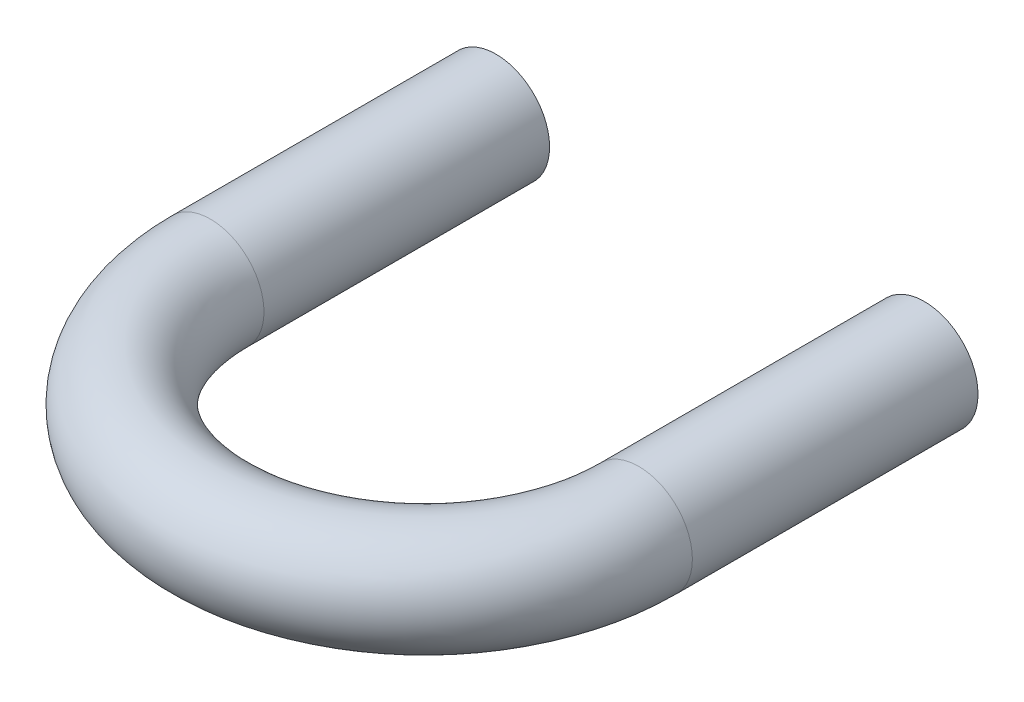
ISO-10303-21;
HEADER;
FILE_DESCRIPTION(('STEP AP214'),'2;1');
FILE_NAME('part.step','',(''),(''),'','','');
FILE_SCHEMA(('AUTOMOTIVE_DESIGN { 1 0 10303 214 1 1 1 1 }'));
ENDSEC;
DATA;
#1=APPLICATION_CONTEXT('core data for automotive mechanical design processes');
#2=APPLICATION_PROTOCOL_DEFINITION('international standard','automotive_design',2000,#1);
#3=PRODUCT_CONTEXT('',#1,'mechanical');
#4=PRODUCT('Part','Part','',(#3));
#5=PRODUCT_RELATED_PRODUCT_CATEGORY('part','',(#4));
#6=PRODUCT_DEFINITION_FORMATION('','',#4);
#7=PRODUCT_DEFINITION_CONTEXT('part definition',#1,'design');
#8=PRODUCT_DEFINITION('design','',#6,#7);
#9=PRODUCT_DEFINITION_SHAPE('','',#8);
#10=(LENGTH_UNIT() NAMED_UNIT(*) SI_UNIT(.MILLI.,.METRE.));
#11=(NAMED_UNIT(*) PLANE_ANGLE_UNIT() SI_UNIT($,.RADIAN.));
#12=(NAMED_UNIT(*) SI_UNIT($,.STERADIAN.) SOLID_ANGLE_UNIT());
#13=UNCERTAINTY_MEASURE_WITH_UNIT(LENGTH_MEASURE(1.E-05),#10,'distance_accuracy_value','');
#14=(GEOMETRIC_REPRESENTATION_CONTEXT(3) GLOBAL_UNCERTAINTY_ASSIGNED_CONTEXT((#13)) GLOBAL_UNIT_ASSIGNED_CONTEXT((#10,
#11,#12)) REPRESENTATION_CONTEXT('',''));
#15=CARTESIAN_POINT('',(0.,0.,0.));
#16=DIRECTION('',(0.,0.,1.));
#17=DIRECTION('',(1.,0.,0.));
#18=AXIS2_PLACEMENT_3D('',#15,#16,#17);
#19=CARTESIAN_POINT('',(30.,0.,40.));
#20=DIRECTION('',(0.,0.,-1.));
#21=DIRECTION('',(-1.,0.,0.));
#22=AXIS2_PLACEMENT_3D('',#19,#20,#21);
#23=CYLINDRICAL_SURFACE('',#22,7.5);
#24=CARTESIAN_POINT('',(30.,0.,40.));
#25=DIRECTION('',(0.,0.,1.));
#26=DIRECTION('',(1.,0.,0.));
#27=AXIS2_PLACEMENT_3D('',#24,#25,#26);
#28=CIRCLE('',#27,7.5);
#29=CARTESIAN_POINT('',(37.5,0.,40.));
#30=VERTEX_POINT('',#29);
#31=EDGE_CURVE('E11',#30,#30,#28,.T.);
#32=ORIENTED_EDGE('',*,*,#31,.F.);
#33=EDGE_LOOP('',(#32));
#34=FACE_BOUND('',#33,.T.);
#35=CARTESIAN_POINT('',(30.,0.,0.));
#36=DIRECTION('',(0.,0.,1.));
#37=DIRECTION('',(1.,0.,0.));
#38=AXIS2_PLACEMENT_3D('',#35,#36,#37);
#39=CIRCLE('',#38,7.5);
#40=CARTESIAN_POINT('',(37.5,0.,0.));
#41=VERTEX_POINT('',#40);
#42=EDGE_CURVE('E45',#41,#41,#39,.T.);
#43=ORIENTED_EDGE('',*,*,#42,.T.);
#44=EDGE_LOOP('',(#43));
#45=FACE_BOUND('',#44,.T.);
#46=ADVANCED_FACE('F42',(#34,#45),#23,.T.);
#47=CARTESIAN_POINT('',(30.,0.,0.));
#48=DIRECTION('',(0.,0.,1.));
#49=DIRECTION('',(1.,0.,0.));
#50=AXIS2_PLACEMENT_3D('',#47,#48,#49);
#51=PLANE('',#50);
#52=ORIENTED_EDGE('',*,*,#42,.F.);
#53=EDGE_LOOP('',(#52));
#54=FACE_BOUND('',#53,.T.);
#55=ADVANCED_FACE('F76',(#54),#51,.F.);
#56=CARTESIAN_POINT('',(0.,0.,40.));
#57=DIRECTION('',(0.,-1.,0.));
#58=DIRECTION('',(0.,0.,-1.));
#59=AXIS2_PLACEMENT_3D('',#56,#57,#58);
#60=TOROIDAL_SURFACE('',#59,30.,7.5);
#61=CARTESIAN_POINT('',(-30.,0.,40.));
#62=DIRECTION('',(0.,0.,-1.));
#63=DIRECTION('',(-1.,0.,0.));
#64=AXIS2_PLACEMENT_3D('',#61,#62,#63);
#65=CIRCLE('',#64,7.5);
#66=CARTESIAN_POINT('',(-37.5,0.,40.));
#67=VERTEX_POINT('',#66);
#68=EDGE_CURVE('E54',#67,#67,#65,.T.);
#69=CARTESIAN_POINT('',(0.,0.,40.));
#70=DIRECTION('',(0.,-1.,0.));
#71=DIRECTION('',(0.,0.,-1.));
#72=AXIS2_PLACEMENT_3D('',#69,#70,#71);
#73=CIRCLE('',#72,37.5);
#74=EDGE_CURVE('',#30,#67,#73,.T.);
#75=ORIENTED_EDGE('',*,*,#31,.T.);
#76=ORIENTED_EDGE('',*,*,#68,.F.);
#77=ORIENTED_EDGE('',*,*,#74,.T.);
#78=ORIENTED_EDGE('',*,*,#74,.F.);
#79=EDGE_LOOP('',(#75,#77,#76,#78));
#80=FACE_BOUND('',#79,.T.);
#81=ADVANCED_FACE('F72',(#80),#60,.T.);
#82=CARTESIAN_POINT('',(-30.,0.,40.));
#83=DIRECTION('',(0.,0.,-1.));
#84=DIRECTION('',(-1.,0.,0.));
#85=AXIS2_PLACEMENT_3D('',#82,#83,#84);
#86=CYLINDRICAL_SURFACE('',#85,7.5);
#87=ORIENTED_EDGE('',*,*,#68,.T.);
#88=EDGE_LOOP('',(#87));
#89=FACE_BOUND('',#88,.T.);
#90=CARTESIAN_POINT('',(-30.,0.,0.));
#91=DIRECTION('',(0.,0.,1.));
#92=DIRECTION('',(1.,0.,0.));
#93=AXIS2_PLACEMENT_3D('',#90,#91,#92);
#94=CIRCLE('',#93,7.5);
#95=CARTESIAN_POINT('',(-22.5,0.,0.));
#96=VERTEX_POINT('',#95);
#97=EDGE_CURVE('E59',#96,#96,#94,.T.);
#98=ORIENTED_EDGE('',*,*,#97,.T.);
#99=EDGE_LOOP('',(#98));
#100=FACE_BOUND('',#99,.T.);
#101=ADVANCED_FACE('F64',(#89,#100),#86,.T.);
#102=CARTESIAN_POINT('',(-30.,0.,0.));
#103=DIRECTION('',(0.,0.,1.));
#104=DIRECTION('',(1.,0.,0.));
#105=AXIS2_PLACEMENT_3D('',#102,#103,#104);
#106=PLANE('',#105);
#107=ORIENTED_EDGE('',*,*,#97,.F.);
#108=EDGE_LOOP('',(#107));
#109=FACE_BOUND('',#108,.T.);
#110=ADVANCED_FACE('F66',(#109),#106,.F.);
#111=CLOSED_SHELL('',(#46,#55,#81,#101,#110));
#112=MANIFOLD_SOLID_BREP('B2',#111);
#113=ADVANCED_BREP_SHAPE_REPRESENTATION('',(#18,#112),#14);
#114=SHAPE_DEFINITION_REPRESENTATION(#9,#113);
ENDSEC;
END-ISO-10303-21;
